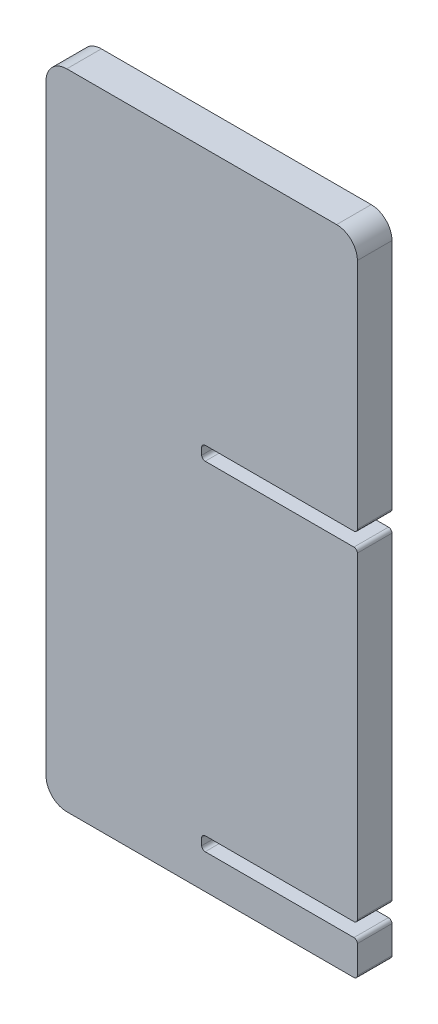
ISO-10303-21;
HEADER;
FILE_DESCRIPTION(('STEP AP214'),'2;1');
FILE_NAME('part.step','',(''),(''),'','','');
FILE_SCHEMA(('AUTOMOTIVE_DESIGN { 1 0 10303 214 1 1 1 1 }'));
ENDSEC;
DATA;
#1=APPLICATION_CONTEXT('core data for automotive mechanical design processes');
#2=APPLICATION_PROTOCOL_DEFINITION('international standard','automotive_design',2000,#1);
#3=PRODUCT_CONTEXT('',#1,'mechanical');
#4=PRODUCT('Part','Part','',(#3));
#5=PRODUCT_RELATED_PRODUCT_CATEGORY('part','',(#4));
#6=PRODUCT_DEFINITION_FORMATION('','',#4);
#7=PRODUCT_DEFINITION_CONTEXT('part definition',#1,'design');
#8=PRODUCT_DEFINITION('design','',#6,#7);
#9=PRODUCT_DEFINITION_SHAPE('','',#8);
#10=(LENGTH_UNIT() NAMED_UNIT(*) SI_UNIT(.MILLI.,.METRE.));
#11=(NAMED_UNIT(*) PLANE_ANGLE_UNIT() SI_UNIT($,.RADIAN.));
#12=(NAMED_UNIT(*) SI_UNIT($,.STERADIAN.) SOLID_ANGLE_UNIT());
#13=UNCERTAINTY_MEASURE_WITH_UNIT(LENGTH_MEASURE(1.E-05),#10,'distance_accuracy_value','');
#14=(GEOMETRIC_REPRESENTATION_CONTEXT(3) GLOBAL_UNCERTAINTY_ASSIGNED_CONTEXT((#13)) GLOBAL_UNIT_ASSIGNED_CONTEXT((#10,
#11,#12)) REPRESENTATION_CONTEXT('',''));
#15=CARTESIAN_POINT('',(0.,0.,0.));
#16=DIRECTION('',(0.,0.,1.));
#17=DIRECTION('',(1.,0.,0.));
#18=AXIS2_PLACEMENT_3D('',#15,#16,#17);
#19=CARTESIAN_POINT('',(22.5,45.,5.));
#20=DIRECTION('',(1.,0.,0.));
#21=DIRECTION('',(0.,1.,0.));
#22=AXIS2_PLACEMENT_3D('',#19,#20,#21);
#23=PLANE('',#22);
#24=DIRECTION('',(0.,-1.,0.));
#25=VECTOR('',#24,1.);
#26=CARTESIAN_POINT('',(22.5,45.,0.));
#27=LINE('',#26,#25);
#28=CARTESIAN_POINT('',(22.5,5.37945189583317,0.));
#29=VERTEX_POINT('',#28);
#30=CARTESIAN_POINT('',(22.5,-40.5,0.));
#31=VERTEX_POINT('',#30);
#32=EDGE_CURVE('E242',#29,#31,#27,.T.);
#33=ORIENTED_EDGE('',*,*,#32,.F.);
#34=DIRECTION('',(0.,0.,1.));
#35=VECTOR('',#34,1.);
#36=CARTESIAN_POINT('',(22.5,5.37945189583315,5.));
#37=LINE('',#36,#35);
#38=CARTESIAN_POINT('',(22.5,5.37945189583317,5.));
#39=VERTEX_POINT('',#38);
#40=EDGE_CURVE('E317',#29,#39,#37,.T.);
#41=ORIENTED_EDGE('',*,*,#40,.T.);
#42=DIRECTION('',(0.,-1.,0.));
#43=VECTOR('',#42,1.);
#44=CARTESIAN_POINT('',(22.5,45.,5.));
#45=LINE('',#44,#43);
#46=CARTESIAN_POINT('',(22.5,-40.5,5.));
#47=VERTEX_POINT('',#46);
#48=EDGE_CURVE('E451',#39,#47,#45,.T.);
#49=ORIENTED_EDGE('',*,*,#48,.T.);
#50=DIRECTION('',(0.,0.,1.));
#51=VECTOR('',#50,1.);
#52=CARTESIAN_POINT('',(22.5,-40.5,0.));
#53=LINE('',#52,#51);
#54=EDGE_CURVE('E314',#47,#31,#53,.F.);
#55=ORIENTED_EDGE('',*,*,#54,.T.);
#56=EDGE_LOOP('',(#33,#41,#49,#55));
#57=FACE_BOUND('',#56,.T.);
#58=ADVANCED_FACE('F43',(#57),#23,.T.);
#59=CARTESIAN_POINT('',(22.5,42.,5.));
#60=VERTEX_POINT('',#59);
#61=CARTESIAN_POINT('',(22.5,8.37945189583317,5.));
#62=VERTEX_POINT('',#61);
#63=EDGE_CURVE('E448',#60,#62,#45,.T.);
#64=ORIENTED_EDGE('',*,*,#63,.T.);
#65=DIRECTION('',(0.,0.,1.));
#66=VECTOR('',#65,1.);
#67=CARTESIAN_POINT('',(22.5,8.37945189583315,0.));
#68=LINE('',#67,#66);
#69=CARTESIAN_POINT('',(22.5,8.37945189583317,0.));
#70=VERTEX_POINT('',#69);
#71=EDGE_CURVE('E335',#62,#70,#68,.F.);
#72=ORIENTED_EDGE('',*,*,#71,.T.);
#73=CARTESIAN_POINT('',(22.5,42.,0.));
#74=VERTEX_POINT('',#73);
#75=EDGE_CURVE('E235',#74,#70,#27,.T.);
#76=ORIENTED_EDGE('',*,*,#75,.F.);
#77=DIRECTION('',(0.,0.,-1.));
#78=VECTOR('',#77,1.);
#79=CARTESIAN_POINT('',(22.5,42.,5.));
#80=LINE('',#79,#78);
#81=EDGE_CURVE('E272',#74,#60,#80,.F.);
#82=ORIENTED_EDGE('',*,*,#81,.T.);
#83=EDGE_LOOP('',(#64,#72,#76,#82));
#84=FACE_BOUND('',#83,.T.);
#85=ADVANCED_FACE('F502',(#84),#23,.T.);
#86=CARTESIAN_POINT('',(-22.5,45.,5.));
#87=DIRECTION('',(0.,1.,0.));
#88=DIRECTION('',(0.,0.,1.));
#89=AXIS2_PLACEMENT_3D('',#86,#87,#88);
#90=PLANE('',#89);
#91=DIRECTION('',(1.,0.,0.));
#92=VECTOR('',#91,1.);
#93=CARTESIAN_POINT('',(-22.5,45.,5.));
#94=LINE('',#93,#92);
#95=CARTESIAN_POINT('',(-19.5,45.,5.));
#96=VERTEX_POINT('',#95);
#97=CARTESIAN_POINT('',(19.5,45.,5.));
#98=VERTEX_POINT('',#97);
#99=EDGE_CURVE('E239',#96,#98,#94,.T.);
#100=ORIENTED_EDGE('',*,*,#99,.T.);
#101=DIRECTION('',(0.,0.,-1.));
#102=VECTOR('',#101,1.);
#103=CARTESIAN_POINT('',(19.5,45.,5.));
#104=LINE('',#103,#102);
#105=CARTESIAN_POINT('',(19.5,45.,0.));
#106=VERTEX_POINT('',#105);
#107=EDGE_CURVE('E268',#98,#106,#104,.T.);
#108=ORIENTED_EDGE('',*,*,#107,.T.);
#109=DIRECTION('',(1.,0.,0.));
#110=VECTOR('',#109,1.);
#111=CARTESIAN_POINT('',(-22.5,45.,0.));
#112=LINE('',#111,#110);
#113=CARTESIAN_POINT('',(-19.5,45.,0.));
#114=VERTEX_POINT('',#113);
#115=EDGE_CURVE('E440',#114,#106,#112,.T.);
#116=ORIENTED_EDGE('',*,*,#115,.F.);
#117=DIRECTION('',(0.,0.,-1.));
#118=VECTOR('',#117,1.);
#119=CARTESIAN_POINT('',(-19.5,45.,5.));
#120=LINE('',#119,#118);
#121=EDGE_CURVE('E265',#114,#96,#120,.F.);
#122=ORIENTED_EDGE('',*,*,#121,.T.);
#123=EDGE_LOOP('',(#100,#108,#116,#122));
#124=FACE_BOUND('',#123,.T.);
#125=ADVANCED_FACE('F493',(#124),#90,.T.);
#126=CARTESIAN_POINT('',(-22.5,45.,5.));
#127=DIRECTION('',(1.,0.,0.));
#128=DIRECTION('',(0.,1.,0.));
#129=AXIS2_PLACEMENT_3D('',#126,#127,#128);
#130=PLANE('',#129);
#131=DIRECTION('',(0.,-1.,0.));
#132=VECTOR('',#131,1.);
#133=CARTESIAN_POINT('',(-22.5,45.,0.));
#134=LINE('',#133,#132);
#135=CARTESIAN_POINT('',(-22.5,42.,0.));
#136=VERTEX_POINT('',#135);
#137=CARTESIAN_POINT('',(-22.5,-45.,0.));
#138=VERTEX_POINT('',#137);
#139=EDGE_CURVE('E234',#136,#138,#134,.T.);
#140=ORIENTED_EDGE('',*,*,#139,.T.);
#141=DIRECTION('',(0.,0.,-1.));
#142=VECTOR('',#141,1.);
#143=CARTESIAN_POINT('',(-22.5,-45.,5.));
#144=LINE('',#143,#142);
#145=CARTESIAN_POINT('',(-22.5,-45.,5.));
#146=VERTEX_POINT('',#145);
#147=EDGE_CURVE('E209',#138,#146,#144,.F.);
#148=ORIENTED_EDGE('',*,*,#147,.T.);
#149=DIRECTION('',(0.,-1.,0.));
#150=VECTOR('',#149,1.);
#151=CARTESIAN_POINT('',(-22.5,45.,5.));
#152=LINE('',#151,#150);
#153=CARTESIAN_POINT('',(-22.5,42.,5.));
#154=VERTEX_POINT('',#153);
#155=EDGE_CURVE('E228',#154,#146,#152,.T.);
#156=ORIENTED_EDGE('',*,*,#155,.F.);
#157=DIRECTION('',(0.,0.,-1.));
#158=VECTOR('',#157,1.);
#159=CARTESIAN_POINT('',(-22.5,42.,0.));
#160=LINE('',#159,#158);
#161=EDGE_CURVE('E215',#154,#136,#160,.T.);
#162=ORIENTED_EDGE('',*,*,#161,.T.);
#163=EDGE_LOOP('',(#140,#148,#156,#162));
#164=FACE_BOUND('',#163,.T.);
#165=ADVANCED_FACE('F488',(#164),#130,.F.);
#166=CARTESIAN_POINT('',(-22.5,-48.,5.));
#167=DIRECTION('',(0.,1.,0.));
#168=DIRECTION('',(0.,0.,1.));
#169=AXIS2_PLACEMENT_3D('',#166,#167,#168);
#170=PLANE('',#169);
#171=DIRECTION('',(1.,0.,0.));
#172=VECTOR('',#171,1.);
#173=CARTESIAN_POINT('',(-22.5,-48.,0.));
#174=LINE('',#173,#172);
#175=CARTESIAN_POINT('',(-19.5,-48.,0.));
#176=VERTEX_POINT('',#175);
#177=CARTESIAN_POINT('',(22.,-48.,0.));
#178=VERTEX_POINT('',#177);
#179=EDGE_CURVE('E222',#176,#178,#174,.T.);
#180=ORIENTED_EDGE('',*,*,#179,.T.);
#181=DIRECTION('',(0.,0.,-1.));
#182=VECTOR('',#181,1.);
#183=CARTESIAN_POINT('',(22.,-48.,5.));
#184=LINE('',#183,#182);
#185=CARTESIAN_POINT('',(22.,-48.,5.));
#186=VERTEX_POINT('',#185);
#187=EDGE_CURVE('E297',#178,#186,#184,.F.);
#188=ORIENTED_EDGE('',*,*,#187,.T.);
#189=DIRECTION('',(1.,0.,0.));
#190=VECTOR('',#189,1.);
#191=CARTESIAN_POINT('',(-22.5,-48.,5.));
#192=LINE('',#191,#190);
#193=CARTESIAN_POINT('',(-19.5,-48.,5.));
#194=VERTEX_POINT('',#193);
#195=EDGE_CURVE('E225',#194,#186,#192,.T.);
#196=ORIENTED_EDGE('',*,*,#195,.F.);
#197=DIRECTION('',(0.,0.,-1.));
#198=VECTOR('',#197,1.);
#199=CARTESIAN_POINT('',(-19.5,-48.,5.));
#200=LINE('',#199,#198);
#201=EDGE_CURVE('E208',#194,#176,#200,.T.);
#202=ORIENTED_EDGE('',*,*,#201,.T.);
#203=EDGE_LOOP('',(#180,#188,#196,#202));
#204=FACE_BOUND('',#203,.T.);
#205=ADVANCED_FACE('F221',(#204),#170,.F.);
#206=CARTESIAN_POINT('',(22.5,-43.5,5.));
#207=VERTEX_POINT('',#206);
#208=CARTESIAN_POINT('',(22.5,-47.5,5.));
#209=VERTEX_POINT('',#208);
#210=EDGE_CURVE('E447',#207,#209,#45,.T.);
#211=ORIENTED_EDGE('',*,*,#210,.T.);
#212=DIRECTION('',(0.,0.,-1.));
#213=VECTOR('',#212,1.);
#214=CARTESIAN_POINT('',(22.5,-47.5,0.));
#215=LINE('',#214,#213);
#216=CARTESIAN_POINT('',(22.5,-47.5,0.));
#217=VERTEX_POINT('',#216);
#218=EDGE_CURVE('E279',#209,#217,#215,.T.);
#219=ORIENTED_EDGE('',*,*,#218,.T.);
#220=CARTESIAN_POINT('',(22.5,-43.5,0.));
#221=VERTEX_POINT('',#220);
#222=EDGE_CURVE('E244',#221,#217,#27,.T.);
#223=ORIENTED_EDGE('',*,*,#222,.F.);
#224=DIRECTION('',(0.,0.,1.));
#225=VECTOR('',#224,1.);
#226=CARTESIAN_POINT('',(22.5,-43.5,5.));
#227=LINE('',#226,#225);
#228=EDGE_CURVE('E275',#221,#207,#227,.T.);
#229=ORIENTED_EDGE('',*,*,#228,.T.);
#230=EDGE_LOOP('',(#211,#219,#223,#229));
#231=FACE_BOUND('',#230,.T.);
#232=ADVANCED_FACE('F478',(#231),#23,.T.);
#233=CARTESIAN_POINT('',(0.,0.,5.));
#234=DIRECTION('',(0.,0.,-1.));
#235=DIRECTION('',(-1.,0.,0.));
#236=AXIS2_PLACEMENT_3D('',#233,#234,#235);
#237=PLANE('',#236);
#238=ORIENTED_EDGE('',*,*,#195,.T.);
#239=CARTESIAN_POINT('',(22.,-47.5,5.));
#240=DIRECTION('',(0.,0.,-1.));
#241=DIRECTION('',(-1.,0.,0.));
#242=AXIS2_PLACEMENT_3D('',#239,#240,#241);
#243=CIRCLE('',#242,0.5);
#244=EDGE_CURVE('E311',#186,#209,#243,.F.);
#245=ORIENTED_EDGE('',*,*,#244,.T.);
#246=ORIENTED_EDGE('',*,*,#210,.F.);
#247=CARTESIAN_POINT('',(22.,-43.5,5.));
#248=DIRECTION('',(0.,0.,-1.));
#249=DIRECTION('',(-1.,0.,0.));
#250=AXIS2_PLACEMENT_3D('',#247,#248,#249);
#251=CIRCLE('',#250,0.5);
#252=CARTESIAN_POINT('',(22.,-43.,5.));
#253=VERTEX_POINT('',#252);
#254=EDGE_CURVE('E303',#207,#253,#251,.F.);
#255=ORIENTED_EDGE('',*,*,#254,.T.);
#256=DIRECTION('',(1.,0.,0.));
#257=VECTOR('',#256,1.);
#258=CARTESIAN_POINT('',(22.5,-43.,5.));
#259=LINE('',#258,#257);
#260=CARTESIAN_POINT('',(0.500000000000007,-43.,5.));
#261=VERTEX_POINT('',#260);
#262=EDGE_CURVE('E418',#261,#253,#259,.T.);
#263=ORIENTED_EDGE('',*,*,#262,.F.);
#264=CARTESIAN_POINT('',(0.5,-42.5,5.));
#265=DIRECTION('',(0.,0.,-1.));
#266=DIRECTION('',(-1.,0.,0.));
#267=AXIS2_PLACEMENT_3D('',#264,#265,#266);
#268=CIRCLE('',#267,0.5);
#269=CARTESIAN_POINT('',(0.,-42.5,5.));
#270=VERTEX_POINT('',#269);
#271=EDGE_CURVE('E377',#261,#270,#268,.T.);
#272=ORIENTED_EDGE('',*,*,#271,.T.);
#273=DIRECTION('',(0.,-1.,0.));
#274=VECTOR('',#273,1.);
#275=CARTESIAN_POINT('',(0.,-41.,5.));
#276=LINE('',#275,#274);
#277=CARTESIAN_POINT('',(0.,-41.5,5.));
#278=VERTEX_POINT('',#277);
#279=EDGE_CURVE('E389',#278,#270,#276,.T.);
#280=ORIENTED_EDGE('',*,*,#279,.F.);
#281=CARTESIAN_POINT('',(0.5,-41.5,5.));
#282=DIRECTION('',(0.,0.,-1.));
#283=DIRECTION('',(-1.,0.,0.));
#284=AXIS2_PLACEMENT_3D('',#281,#282,#283);
#285=CIRCLE('',#284,0.5);
#286=CARTESIAN_POINT('',(0.500000000000007,-41.,5.));
#287=VERTEX_POINT('',#286);
#288=EDGE_CURVE('E52',#278,#287,#285,.T.);
#289=ORIENTED_EDGE('',*,*,#288,.T.);
#290=DIRECTION('',(-1.,0.,0.));
#291=VECTOR('',#290,1.);
#292=CARTESIAN_POINT('',(22.5,-41.,5.));
#293=LINE('',#292,#291);
#294=CARTESIAN_POINT('',(22.,-41.,5.));
#295=VERTEX_POINT('',#294);
#296=EDGE_CURVE('E387',#295,#287,#293,.T.);
#297=ORIENTED_EDGE('',*,*,#296,.F.);
#298=CARTESIAN_POINT('',(22.,-40.5,5.));
#299=DIRECTION('',(0.,0.,-1.));
#300=DIRECTION('',(-1.,0.,0.));
#301=AXIS2_PLACEMENT_3D('',#298,#299,#300);
#302=CIRCLE('',#301,0.5);
#303=EDGE_CURVE('E300',#295,#47,#302,.F.);
#304=ORIENTED_EDGE('',*,*,#303,.T.);
#305=ORIENTED_EDGE('',*,*,#48,.F.);
#306=CARTESIAN_POINT('',(22.,5.37945189583315,5.));
#307=DIRECTION('',(0.,0.,-1.));
#308=DIRECTION('',(-1.,0.,0.));
#309=AXIS2_PLACEMENT_3D('',#306,#307,#308);
#310=CIRCLE('',#309,0.5);
#311=CARTESIAN_POINT('',(22.,5.87945189583315,5.));
#312=VERTEX_POINT('',#311);
#313=EDGE_CURVE('E308',#39,#312,#310,.F.);
#314=ORIENTED_EDGE('',*,*,#313,.T.);
#315=DIRECTION('',(1.,0.,0.));
#316=VECTOR('',#315,1.);
#317=CARTESIAN_POINT('',(22.5,5.87945189583315,5.));
#318=LINE('',#317,#316);
#319=CARTESIAN_POINT('',(0.500000000000007,5.87945189583315,5.));
#320=VERTEX_POINT('',#319);
#321=EDGE_CURVE('E421',#320,#312,#318,.T.);
#322=ORIENTED_EDGE('',*,*,#321,.F.);
#323=CARTESIAN_POINT('',(0.5,6.37945189583315,5.));
#324=DIRECTION('',(0.,0.,-1.));
#325=DIRECTION('',(-1.,0.,0.));
#326=AXIS2_PLACEMENT_3D('',#323,#324,#325);
#327=CIRCLE('',#326,0.5);
#328=CARTESIAN_POINT('',(0.,6.37945189583315,5.));
#329=VERTEX_POINT('',#328);
#330=EDGE_CURVE('E371',#320,#329,#327,.T.);
#331=ORIENTED_EDGE('',*,*,#330,.T.);
#332=DIRECTION('',(0.,-1.,0.));
#333=VECTOR('',#332,1.);
#334=CARTESIAN_POINT('',(0.,7.87945189583315,5.));
#335=LINE('',#334,#333);
#336=CARTESIAN_POINT('',(0.,7.37945189583315,5.));
#337=VERTEX_POINT('',#336);
#338=EDGE_CURVE('E426',#337,#329,#335,.T.);
#339=ORIENTED_EDGE('',*,*,#338,.F.);
#340=CARTESIAN_POINT('',(0.5,7.37945189583315,5.));
#341=DIRECTION('',(0.,0.,-1.));
#342=DIRECTION('',(-1.,0.,0.));
#343=AXIS2_PLACEMENT_3D('',#340,#341,#342);
#344=CIRCLE('',#343,0.5);
#345=CARTESIAN_POINT('',(0.500000000000007,7.87945189583315,5.));
#346=VERTEX_POINT('',#345);
#347=EDGE_CURVE('E65',#337,#346,#344,.T.);
#348=ORIENTED_EDGE('',*,*,#347,.T.);
#349=DIRECTION('',(-1.,0.,0.));
#350=VECTOR('',#349,1.);
#351=CARTESIAN_POINT('',(22.5,7.87945189583315,5.));
#352=LINE('',#351,#350);
#353=CARTESIAN_POINT('',(22.,7.87945189583315,5.));
#354=VERTEX_POINT('',#353);
#355=EDGE_CURVE('E416',#354,#346,#352,.T.);
#356=ORIENTED_EDGE('',*,*,#355,.F.);
#357=CARTESIAN_POINT('',(22.,8.37945189583315,5.));
#358=DIRECTION('',(0.,0.,-1.));
#359=DIRECTION('',(-1.,0.,0.));
#360=AXIS2_PLACEMENT_3D('',#357,#358,#359);
#361=CIRCLE('',#360,0.5);
#362=EDGE_CURVE('E59',#354,#62,#361,.F.);
#363=ORIENTED_EDGE('',*,*,#362,.T.);
#364=ORIENTED_EDGE('',*,*,#63,.F.);
#365=CARTESIAN_POINT('',(19.5,42.,5.));
#366=DIRECTION('',(0.,0.,-1.));
#367=DIRECTION('',(-1.,0.,0.));
#368=AXIS2_PLACEMENT_3D('',#365,#366,#367);
#369=CIRCLE('',#368,3.);
#370=EDGE_CURVE('E259',#60,#98,#369,.F.);
#371=ORIENTED_EDGE('',*,*,#370,.T.);
#372=ORIENTED_EDGE('',*,*,#99,.F.);
#373=CARTESIAN_POINT('',(-19.5,42.,5.));
#374=DIRECTION('',(0.,0.,-1.));
#375=DIRECTION('',(-1.,0.,0.));
#376=AXIS2_PLACEMENT_3D('',#373,#374,#375);
#377=CIRCLE('',#376,3.);
#378=EDGE_CURVE('E256',#96,#154,#377,.F.);
#379=ORIENTED_EDGE('',*,*,#378,.T.);
#380=ORIENTED_EDGE('',*,*,#155,.T.);
#381=CARTESIAN_POINT('',(-19.5,-45.,5.));
#382=DIRECTION('',(0.,0.,-1.));
#383=DIRECTION('',(-1.,0.,0.));
#384=AXIS2_PLACEMENT_3D('',#381,#382,#383);
#385=CIRCLE('',#384,3.);
#386=EDGE_CURVE('E262',#146,#194,#385,.F.);
#387=ORIENTED_EDGE('',*,*,#386,.T.);
#388=EDGE_LOOP('',(#238,#245,#246,#255,#263,#272,#280,#289,#297,#304,#305,#314,#322,#331,#339,
#348,#356,#363,#364,#371,#372,#379,#380,#387));
#389=FACE_BOUND('',#388,.T.);
#390=ADVANCED_FACE('F386',(#389),#237,.F.);
#391=CARTESIAN_POINT('',(0.,0.,0.));
#392=DIRECTION('',(0.,0.,-1.));
#393=DIRECTION('',(-1.,0.,0.));
#394=AXIS2_PLACEMENT_3D('',#391,#392,#393);
#395=PLANE('',#394);
#396=ORIENTED_EDGE('',*,*,#222,.T.);
#397=CARTESIAN_POINT('',(22.,-47.5,0.));
#398=DIRECTION('',(0.,0.,-1.));
#399=DIRECTION('',(-1.,0.,0.));
#400=AXIS2_PLACEMENT_3D('',#397,#398,#399);
#401=CIRCLE('',#400,0.5);
#402=EDGE_CURVE('E232',#217,#178,#401,.T.);
#403=ORIENTED_EDGE('',*,*,#402,.T.);
#404=ORIENTED_EDGE('',*,*,#179,.F.);
#405=CARTESIAN_POINT('',(-19.5,-45.,0.));
#406=DIRECTION('',(0.,0.,-1.));
#407=DIRECTION('',(-1.,0.,0.));
#408=AXIS2_PLACEMENT_3D('',#405,#406,#407);
#409=CIRCLE('',#408,3.);
#410=EDGE_CURVE('E204',#176,#138,#409,.T.);
#411=ORIENTED_EDGE('',*,*,#410,.T.);
#412=ORIENTED_EDGE('',*,*,#139,.F.);
#413=CARTESIAN_POINT('',(-19.5,42.,0.));
#414=DIRECTION('',(0.,0.,-1.));
#415=DIRECTION('',(-1.,0.,0.));
#416=AXIS2_PLACEMENT_3D('',#413,#414,#415);
#417=CIRCLE('',#416,3.);
#418=EDGE_CURVE('E227',#136,#114,#417,.T.);
#419=ORIENTED_EDGE('',*,*,#418,.T.);
#420=ORIENTED_EDGE('',*,*,#115,.T.);
#421=CARTESIAN_POINT('',(19.5,42.,0.));
#422=DIRECTION('',(0.,0.,-1.));
#423=DIRECTION('',(-1.,0.,0.));
#424=AXIS2_PLACEMENT_3D('',#421,#422,#423);
#425=CIRCLE('',#424,3.);
#426=EDGE_CURVE('E216',#106,#74,#425,.T.);
#427=ORIENTED_EDGE('',*,*,#426,.T.);
#428=ORIENTED_EDGE('',*,*,#75,.T.);
#429=CARTESIAN_POINT('',(22.,8.37945189583315,0.));
#430=DIRECTION('',(0.,0.,-1.));
#431=DIRECTION('',(-1.,0.,0.));
#432=AXIS2_PLACEMENT_3D('',#429,#430,#431);
#433=CIRCLE('',#432,0.5);
#434=CARTESIAN_POINT('',(22.,7.87945189583315,0.));
#435=VERTEX_POINT('',#434);
#436=EDGE_CURVE('E289',#70,#435,#433,.T.);
#437=ORIENTED_EDGE('',*,*,#436,.T.);
#438=DIRECTION('',(-1.,0.,0.));
#439=VECTOR('',#438,1.);
#440=CARTESIAN_POINT('',(22.5,7.87945189583315,0.));
#441=LINE('',#440,#439);
#442=CARTESIAN_POINT('',(0.5,7.87945189583315,0.));
#443=VERTEX_POINT('',#442);
#444=EDGE_CURVE('E425',#435,#443,#441,.T.);
#445=ORIENTED_EDGE('',*,*,#444,.T.);
#446=CARTESIAN_POINT('',(0.5,7.37945189583315,0.));
#447=DIRECTION('',(0.,0.,-1.));
#448=DIRECTION('',(-1.,0.,0.));
#449=AXIS2_PLACEMENT_3D('',#446,#447,#448);
#450=CIRCLE('',#449,0.5);
#451=CARTESIAN_POINT('',(0.,7.37945189583315,0.));
#452=VERTEX_POINT('',#451);
#453=EDGE_CURVE('E368',#443,#452,#450,.F.);
#454=ORIENTED_EDGE('',*,*,#453,.T.);
#455=DIRECTION('',(0.,-1.,0.));
#456=VECTOR('',#455,1.);
#457=CARTESIAN_POINT('',(0.,7.87945189583315,0.));
#458=LINE('',#457,#456);
#459=CARTESIAN_POINT('',(0.,6.37945189583315,0.));
#460=VERTEX_POINT('',#459);
#461=EDGE_CURVE('E435',#452,#460,#458,.T.);
#462=ORIENTED_EDGE('',*,*,#461,.T.);
#463=CARTESIAN_POINT('',(0.5,6.37945189583315,0.));
#464=DIRECTION('',(0.,0.,-1.));
#465=DIRECTION('',(-1.,0.,0.));
#466=AXIS2_PLACEMENT_3D('',#463,#464,#465);
#467=CIRCLE('',#466,0.5);
#468=CARTESIAN_POINT('',(0.5,5.87945189583315,0.));
#469=VERTEX_POINT('',#468);
#470=EDGE_CURVE('E374',#460,#469,#467,.F.);
#471=ORIENTED_EDGE('',*,*,#470,.T.);
#472=DIRECTION('',(1.,0.,0.));
#473=VECTOR('',#472,1.);
#474=CARTESIAN_POINT('',(22.5,5.87945189583315,0.));
#475=LINE('',#474,#473);
#476=CARTESIAN_POINT('',(22.,5.87945189583315,0.));
#477=VERTEX_POINT('',#476);
#478=EDGE_CURVE('E436',#469,#477,#475,.T.);
#479=ORIENTED_EDGE('',*,*,#478,.T.);
#480=CARTESIAN_POINT('',(22.,5.37945189583315,0.));
#481=DIRECTION('',(0.,0.,-1.));
#482=DIRECTION('',(-1.,0.,0.));
#483=AXIS2_PLACEMENT_3D('',#480,#481,#482);
#484=CIRCLE('',#483,0.5);
#485=EDGE_CURVE('E292',#477,#29,#484,.T.);
#486=ORIENTED_EDGE('',*,*,#485,.T.);
#487=ORIENTED_EDGE('',*,*,#32,.T.);
#488=CARTESIAN_POINT('',(22.,-40.5,0.));
#489=DIRECTION('',(0.,0.,-1.));
#490=DIRECTION('',(-1.,0.,0.));
#491=AXIS2_PLACEMENT_3D('',#488,#489,#490);
#492=CIRCLE('',#491,0.5);
#493=CARTESIAN_POINT('',(22.,-41.,0.));
#494=VERTEX_POINT('',#493);
#495=EDGE_CURVE('E283',#31,#494,#492,.T.);
#496=ORIENTED_EDGE('',*,*,#495,.T.);
#497=DIRECTION('',(-1.,0.,0.));
#498=VECTOR('',#497,1.);
#499=CARTESIAN_POINT('',(22.5,-41.,0.));
#500=LINE('',#499,#498);
#501=CARTESIAN_POINT('',(0.5,-41.,0.));
#502=VERTEX_POINT('',#501);
#503=EDGE_CURVE('E406',#494,#502,#500,.T.);
#504=ORIENTED_EDGE('',*,*,#503,.T.);
#505=CARTESIAN_POINT('',(0.5,-41.5,0.));
#506=DIRECTION('',(0.,0.,-1.));
#507=DIRECTION('',(-1.,0.,0.));
#508=AXIS2_PLACEMENT_3D('',#505,#506,#507);
#509=CIRCLE('',#508,0.5);
#510=CARTESIAN_POINT('',(0.,-41.5,0.));
#511=VERTEX_POINT('',#510);
#512=EDGE_CURVE('E11',#502,#511,#509,.F.);
#513=ORIENTED_EDGE('',*,*,#512,.T.);
#514=DIRECTION('',(0.,-1.,0.));
#515=VECTOR('',#514,1.);
#516=CARTESIAN_POINT('',(0.,-41.,0.));
#517=LINE('',#516,#515);
#518=CARTESIAN_POINT('',(0.,-42.5,0.));
#519=VERTEX_POINT('',#518);
#520=EDGE_CURVE('E404',#511,#519,#517,.T.);
#521=ORIENTED_EDGE('',*,*,#520,.T.);
#522=CARTESIAN_POINT('',(0.5,-42.5,0.));
#523=DIRECTION('',(0.,0.,-1.));
#524=DIRECTION('',(-1.,0.,0.));
#525=AXIS2_PLACEMENT_3D('',#522,#523,#524);
#526=CIRCLE('',#525,0.5);
#527=CARTESIAN_POINT('',(0.5,-43.,0.));
#528=VERTEX_POINT('',#527);
#529=EDGE_CURVE('E380',#519,#528,#526,.F.);
#530=ORIENTED_EDGE('',*,*,#529,.T.);
#531=DIRECTION('',(1.,0.,0.));
#532=VECTOR('',#531,1.);
#533=CARTESIAN_POINT('',(22.5,-43.,0.));
#534=LINE('',#533,#532);
#535=CARTESIAN_POINT('',(22.,-43.,0.));
#536=VERTEX_POINT('',#535);
#537=EDGE_CURVE('E411',#528,#536,#534,.T.);
#538=ORIENTED_EDGE('',*,*,#537,.T.);
#539=CARTESIAN_POINT('',(22.,-43.5,0.));
#540=DIRECTION('',(0.,0.,-1.));
#541=DIRECTION('',(-1.,0.,0.));
#542=AXIS2_PLACEMENT_3D('',#539,#540,#541);
#543=CIRCLE('',#542,0.5);
#544=EDGE_CURVE('E286',#536,#221,#543,.T.);
#545=ORIENTED_EDGE('',*,*,#544,.T.);
#546=EDGE_LOOP('',(#396,#403,#404,#411,#412,#419,#420,#427,#428,#437,#445,#454,#462,#471,#479,
#486,#487,#496,#504,#513,#521,#530,#538,#545));
#547=FACE_BOUND('',#546,.T.);
#548=ADVANCED_FACE('F231',(#547),#395,.T.);
#549=CARTESIAN_POINT('',(22.5,7.87945189583315,-22.588713996153));
#550=DIRECTION('',(0.,1.,0.));
#551=DIRECTION('',(-1.,0.,0.));
#552=AXIS2_PLACEMENT_3D('',#549,#550,#551);
#553=PLANE('',#552);
#554=ORIENTED_EDGE('',*,*,#444,.F.);
#555=DIRECTION('',(0.,0.,1.));
#556=VECTOR('',#555,1.);
#557=CARTESIAN_POINT('',(22.,7.87945189583315,5.));
#558=LINE('',#557,#556);
#559=EDGE_CURVE('E331',#435,#354,#558,.T.);
#560=ORIENTED_EDGE('',*,*,#559,.T.);
#561=ORIENTED_EDGE('',*,*,#355,.T.);
#562=DIRECTION('',(0.,0.,1.));
#563=VECTOR('',#562,1.);
#564=CARTESIAN_POINT('',(0.5,7.87945189583315,0.));
#565=LINE('',#564,#563);
#566=EDGE_CURVE('E328',#346,#443,#565,.F.);
#567=ORIENTED_EDGE('',*,*,#566,.T.);
#568=EDGE_LOOP('',(#554,#560,#561,#567));
#569=FACE_BOUND('',#568,.T.);
#570=ADVANCED_FACE('F510',(#569),#553,.F.);
#571=CARTESIAN_POINT('',(0.,7.87945189583315,-22.588713996153));
#572=DIRECTION('',(-1.,0.,0.));
#573=DIRECTION('',(0.,-1.,0.));
#574=AXIS2_PLACEMENT_3D('',#571,#572,#573);
#575=PLANE('',#574);
#576=ORIENTED_EDGE('',*,*,#461,.F.);
#577=DIRECTION('',(0.,0.,1.));
#578=VECTOR('',#577,1.);
#579=CARTESIAN_POINT('',(0.,7.37945189583315,5.));
#580=LINE('',#579,#578);
#581=EDGE_CURVE('E341',#452,#337,#580,.T.);
#582=ORIENTED_EDGE('',*,*,#581,.T.);
#583=ORIENTED_EDGE('',*,*,#338,.T.);
#584=DIRECTION('',(0.,0.,1.));
#585=VECTOR('',#584,1.);
#586=CARTESIAN_POINT('',(0.,6.37945189583315,0.));
#587=LINE('',#586,#585);
#588=EDGE_CURVE('E338',#329,#460,#587,.F.);
#589=ORIENTED_EDGE('',*,*,#588,.T.);
#590=EDGE_LOOP('',(#576,#582,#583,#589));
#591=FACE_BOUND('',#590,.T.);
#592=ADVANCED_FACE('F518',(#591),#575,.F.);
#593=CARTESIAN_POINT('',(22.5,5.87945189583315,-22.588713996153));
#594=DIRECTION('',(0.,-1.,0.));
#595=DIRECTION('',(0.,0.,-1.));
#596=AXIS2_PLACEMENT_3D('',#593,#594,#595);
#597=PLANE('',#596);
#598=ORIENTED_EDGE('',*,*,#321,.T.);
#599=DIRECTION('',(0.,0.,1.));
#600=VECTOR('',#599,1.);
#601=CARTESIAN_POINT('',(22.,5.87945189583315,0.));
#602=LINE('',#601,#600);
#603=EDGE_CURVE('E325',#312,#477,#602,.F.);
#604=ORIENTED_EDGE('',*,*,#603,.T.);
#605=ORIENTED_EDGE('',*,*,#478,.F.);
#606=DIRECTION('',(0.,0.,1.));
#607=VECTOR('',#606,1.);
#608=CARTESIAN_POINT('',(0.5,5.87945189583315,5.));
#609=LINE('',#608,#607);
#610=EDGE_CURVE('E321',#469,#320,#609,.T.);
#611=ORIENTED_EDGE('',*,*,#610,.T.);
#612=EDGE_LOOP('',(#598,#604,#605,#611));
#613=FACE_BOUND('',#612,.T.);
#614=ADVANCED_FACE('F525',(#613),#597,.F.);
#615=CARTESIAN_POINT('',(22.5,-41.,-22.588713996153));
#616=DIRECTION('',(0.,1.,0.));
#617=DIRECTION('',(0.,0.,1.));
#618=AXIS2_PLACEMENT_3D('',#615,#616,#617);
#619=PLANE('',#618);
#620=ORIENTED_EDGE('',*,*,#296,.T.);
#621=DIRECTION('',(0.,0.,1.));
#622=VECTOR('',#621,1.);
#623=CARTESIAN_POINT('',(0.5,-41.,0.));
#624=LINE('',#623,#622);
#625=EDGE_CURVE('E363',#287,#502,#624,.F.);
#626=ORIENTED_EDGE('',*,*,#625,.T.);
#627=ORIENTED_EDGE('',*,*,#503,.F.);
#628=DIRECTION('',(0.,0.,1.));
#629=VECTOR('',#628,1.);
#630=CARTESIAN_POINT('',(22.,-41.,5.));
#631=LINE('',#630,#629);
#632=EDGE_CURVE('E359',#494,#295,#631,.T.);
#633=ORIENTED_EDGE('',*,*,#632,.T.);
#634=EDGE_LOOP('',(#620,#626,#627,#633));
#635=FACE_BOUND('',#634,.T.);
#636=ADVANCED_FACE('F394',(#635),#619,.F.);
#637=CARTESIAN_POINT('',(0.,-41.,-22.588713996153));
#638=DIRECTION('',(-1.,0.,0.));
#639=DIRECTION('',(0.,-1.,0.));
#640=AXIS2_PLACEMENT_3D('',#637,#638,#639);
#641=PLANE('',#640);
#642=ORIENTED_EDGE('',*,*,#279,.T.);
#643=DIRECTION('',(0.,0.,1.));
#644=VECTOR('',#643,1.);
#645=CARTESIAN_POINT('',(0.,-42.5,0.));
#646=LINE('',#645,#644);
#647=EDGE_CURVE('E356',#270,#519,#646,.F.);
#648=ORIENTED_EDGE('',*,*,#647,.T.);
#649=ORIENTED_EDGE('',*,*,#520,.F.);
#650=DIRECTION('',(0.,0.,1.));
#651=VECTOR('',#650,1.);
#652=CARTESIAN_POINT('',(0.,-41.5,5.));
#653=LINE('',#652,#651);
#654=EDGE_CURVE('E352',#511,#278,#653,.T.);
#655=ORIENTED_EDGE('',*,*,#654,.T.);
#656=EDGE_LOOP('',(#642,#648,#649,#655));
#657=FACE_BOUND('',#656,.T.);
#658=ADVANCED_FACE('F408',(#657),#641,.F.);
#659=CARTESIAN_POINT('',(22.5,-43.,-22.588713996153));
#660=DIRECTION('',(0.,-1.,0.));
#661=DIRECTION('',(0.,0.,-1.));
#662=AXIS2_PLACEMENT_3D('',#659,#660,#661);
#663=PLANE('',#662);
#664=ORIENTED_EDGE('',*,*,#262,.T.);
#665=DIRECTION('',(0.,0.,1.));
#666=VECTOR('',#665,1.);
#667=CARTESIAN_POINT('',(22.,-43.,0.));
#668=LINE('',#667,#666);
#669=EDGE_CURVE('E349',#253,#536,#668,.F.);
#670=ORIENTED_EDGE('',*,*,#669,.T.);
#671=ORIENTED_EDGE('',*,*,#537,.F.);
#672=DIRECTION('',(0.,0.,1.));
#673=VECTOR('',#672,1.);
#674=CARTESIAN_POINT('',(0.5,-43.,5.));
#675=LINE('',#674,#673);
#676=EDGE_CURVE('E345',#528,#261,#675,.T.);
#677=ORIENTED_EDGE('',*,*,#676,.T.);
#678=EDGE_LOOP('',(#664,#670,#671,#677));
#679=FACE_BOUND('',#678,.T.);
#680=ADVANCED_FACE('F568',(#679),#663,.F.);
#681=CARTESIAN_POINT('',(-19.5,-45.,5.));
#682=DIRECTION('',(0.,0.,-1.));
#683=DIRECTION('',(-1.,0.,0.));
#684=AXIS2_PLACEMENT_3D('',#681,#682,#683);
#685=CYLINDRICAL_SURFACE('',#684,3.);
#686=ORIENTED_EDGE('',*,*,#386,.F.);
#687=ORIENTED_EDGE('',*,*,#147,.F.);
#688=ORIENTED_EDGE('',*,*,#410,.F.);
#689=ORIENTED_EDGE('',*,*,#201,.F.);
#690=EDGE_LOOP('',(#686,#687,#688,#689));
#691=FACE_BOUND('',#690,.T.);
#692=ADVANCED_FACE('F207',(#691),#685,.T.);
#693=CARTESIAN_POINT('',(19.5,42.,5.));
#694=DIRECTION('',(0.,0.,-1.));
#695=DIRECTION('',(-1.,0.,0.));
#696=AXIS2_PLACEMENT_3D('',#693,#694,#695);
#697=CYLINDRICAL_SURFACE('',#696,3.);
#698=ORIENTED_EDGE('',*,*,#370,.F.);
#699=ORIENTED_EDGE('',*,*,#81,.F.);
#700=ORIENTED_EDGE('',*,*,#426,.F.);
#701=ORIENTED_EDGE('',*,*,#107,.F.);
#702=EDGE_LOOP('',(#698,#699,#700,#701));
#703=FACE_BOUND('',#702,.T.);
#704=ADVANCED_FACE('F497',(#703),#697,.T.);
#705=CARTESIAN_POINT('',(-19.5,42.,5.));
#706=DIRECTION('',(0.,0.,1.));
#707=DIRECTION('',(1.,0.,0.));
#708=AXIS2_PLACEMENT_3D('',#705,#706,#707);
#709=CYLINDRICAL_SURFACE('',#708,3.);
#710=ORIENTED_EDGE('',*,*,#378,.F.);
#711=ORIENTED_EDGE('',*,*,#121,.F.);
#712=ORIENTED_EDGE('',*,*,#418,.F.);
#713=ORIENTED_EDGE('',*,*,#161,.F.);
#714=EDGE_LOOP('',(#710,#711,#712,#713));
#715=FACE_BOUND('',#714,.T.);
#716=ADVANCED_FACE('F490',(#715),#709,.T.);
#717=CARTESIAN_POINT('',(22.,-47.5,5.));
#718=DIRECTION('',(0.,0.,1.));
#719=DIRECTION('',(1.,0.,0.));
#720=AXIS2_PLACEMENT_3D('',#717,#718,#719);
#721=CYLINDRICAL_SURFACE('',#720,0.5);
#722=ORIENTED_EDGE('',*,*,#244,.F.);
#723=ORIENTED_EDGE('',*,*,#187,.F.);
#724=ORIENTED_EDGE('',*,*,#402,.F.);
#725=ORIENTED_EDGE('',*,*,#218,.F.);
#726=EDGE_LOOP('',(#722,#723,#724,#725));
#727=FACE_BOUND('',#726,.T.);
#728=ADVANCED_FACE('F482',(#727),#721,.T.);
#729=CARTESIAN_POINT('',(22.,5.37945189583315,5.));
#730=DIRECTION('',(0.,0.,-1.));
#731=DIRECTION('',(-1.,0.,0.));
#732=AXIS2_PLACEMENT_3D('',#729,#730,#731);
#733=CYLINDRICAL_SURFACE('',#732,0.5);
#734=ORIENTED_EDGE('',*,*,#485,.F.);
#735=ORIENTED_EDGE('',*,*,#603,.F.);
#736=ORIENTED_EDGE('',*,*,#313,.F.);
#737=ORIENTED_EDGE('',*,*,#40,.F.);
#738=EDGE_LOOP('',(#734,#735,#736,#737));
#739=FACE_BOUND('',#738,.T.);
#740=ADVANCED_FACE('F529',(#739),#733,.T.);
#741=CARTESIAN_POINT('',(22.,8.37945189583315,-22.588713996153));
#742=DIRECTION('',(0.,0.,-1.));
#743=DIRECTION('',(-1.,0.,0.));
#744=AXIS2_PLACEMENT_3D('',#741,#742,#743);
#745=CYLINDRICAL_SURFACE('',#744,0.5);
#746=ORIENTED_EDGE('',*,*,#436,.F.);
#747=ORIENTED_EDGE('',*,*,#71,.F.);
#748=ORIENTED_EDGE('',*,*,#362,.F.);
#749=ORIENTED_EDGE('',*,*,#559,.F.);
#750=EDGE_LOOP('',(#746,#747,#748,#749));
#751=FACE_BOUND('',#750,.T.);
#752=ADVANCED_FACE('F505',(#751),#745,.T.);
#753=CARTESIAN_POINT('',(0.5,7.37945189583315,-22.588713996153));
#754=DIRECTION('',(0.,0.,-1.));
#755=DIRECTION('',(-1.,0.,0.));
#756=AXIS2_PLACEMENT_3D('',#753,#754,#755);
#757=CYLINDRICAL_SURFACE('',#756,0.5);
#758=ORIENTED_EDGE('',*,*,#453,.F.);
#759=ORIENTED_EDGE('',*,*,#566,.F.);
#760=ORIENTED_EDGE('',*,*,#347,.F.);
#761=ORIENTED_EDGE('',*,*,#581,.F.);
#762=EDGE_LOOP('',(#758,#759,#760,#761));
#763=FACE_BOUND('',#762,.T.);
#764=ADVANCED_FACE('F513',(#763),#757,.F.);
#765=CARTESIAN_POINT('',(0.5,6.37945189583315,-22.588713996153));
#766=DIRECTION('',(0.,0.,-1.));
#767=DIRECTION('',(-1.,0.,0.));
#768=AXIS2_PLACEMENT_3D('',#765,#766,#767);
#769=CYLINDRICAL_SURFACE('',#768,0.5);
#770=ORIENTED_EDGE('',*,*,#470,.F.);
#771=ORIENTED_EDGE('',*,*,#588,.F.);
#772=ORIENTED_EDGE('',*,*,#330,.F.);
#773=ORIENTED_EDGE('',*,*,#610,.F.);
#774=EDGE_LOOP('',(#770,#771,#772,#773));
#775=FACE_BOUND('',#774,.T.);
#776=ADVANCED_FACE('F521',(#775),#769,.F.);
#777=CARTESIAN_POINT('',(22.,-43.5,5.));
#778=DIRECTION('',(0.,0.,-1.));
#779=DIRECTION('',(-1.,0.,0.));
#780=AXIS2_PLACEMENT_3D('',#777,#778,#779);
#781=CYLINDRICAL_SURFACE('',#780,0.5);
#782=ORIENTED_EDGE('',*,*,#544,.F.);
#783=ORIENTED_EDGE('',*,*,#669,.F.);
#784=ORIENTED_EDGE('',*,*,#254,.F.);
#785=ORIENTED_EDGE('',*,*,#228,.F.);
#786=EDGE_LOOP('',(#782,#783,#784,#785));
#787=FACE_BOUND('',#786,.T.);
#788=ADVANCED_FACE('F584',(#787),#781,.T.);
#789=CARTESIAN_POINT('',(0.5,-42.5,-22.588713996153));
#790=DIRECTION('',(0.,0.,-1.));
#791=DIRECTION('',(-1.,0.,0.));
#792=AXIS2_PLACEMENT_3D('',#789,#790,#791);
#793=CYLINDRICAL_SURFACE('',#792,0.5);
#794=ORIENTED_EDGE('',*,*,#529,.F.);
#795=ORIENTED_EDGE('',*,*,#647,.F.);
#796=ORIENTED_EDGE('',*,*,#271,.F.);
#797=ORIENTED_EDGE('',*,*,#676,.F.);
#798=EDGE_LOOP('',(#794,#795,#796,#797));
#799=FACE_BOUND('',#798,.T.);
#800=ADVANCED_FACE('F586',(#799),#793,.F.);
#801=CARTESIAN_POINT('',(0.5,-41.5,-22.588713996153));
#802=DIRECTION('',(0.,0.,-1.));
#803=DIRECTION('',(-1.,0.,0.));
#804=AXIS2_PLACEMENT_3D('',#801,#802,#803);
#805=CYLINDRICAL_SURFACE('',#804,0.5);
#806=ORIENTED_EDGE('',*,*,#512,.F.);
#807=ORIENTED_EDGE('',*,*,#625,.F.);
#808=ORIENTED_EDGE('',*,*,#288,.F.);
#809=ORIENTED_EDGE('',*,*,#654,.F.);
#810=EDGE_LOOP('',(#806,#807,#808,#809));
#811=FACE_BOUND('',#810,.T.);
#812=ADVANCED_FACE('F401',(#811),#805,.F.);
#813=CARTESIAN_POINT('',(22.,-40.5,-22.588713996153));
#814=DIRECTION('',(0.,0.,-1.));
#815=DIRECTION('',(-1.,0.,0.));
#816=AXIS2_PLACEMENT_3D('',#813,#814,#815);
#817=CYLINDRICAL_SURFACE('',#816,0.5);
#818=ORIENTED_EDGE('',*,*,#495,.F.);
#819=ORIENTED_EDGE('',*,*,#54,.F.);
#820=ORIENTED_EDGE('',*,*,#303,.F.);
#821=ORIENTED_EDGE('',*,*,#632,.F.);
#822=EDGE_LOOP('',(#818,#819,#820,#821));
#823=FACE_BOUND('',#822,.T.);
#824=ADVANCED_FACE('F45',(#823),#817,.T.);
#825=CLOSED_SHELL('',(#58,#85,#125,#165,#205,#232,#390,#548,#570,#592,#614,#636,#658,#680,#692,
#704,#716,#728,#740,#752,#764,#776,#788,#800,#812,#824));
#826=MANIFOLD_SOLID_BREP('B2',#825);
#827=ADVANCED_BREP_SHAPE_REPRESENTATION('',(#18,#826),#14);
#828=SHAPE_DEFINITION_REPRESENTATION(#9,#827);
ENDSEC;
END-ISO-10303-21;
